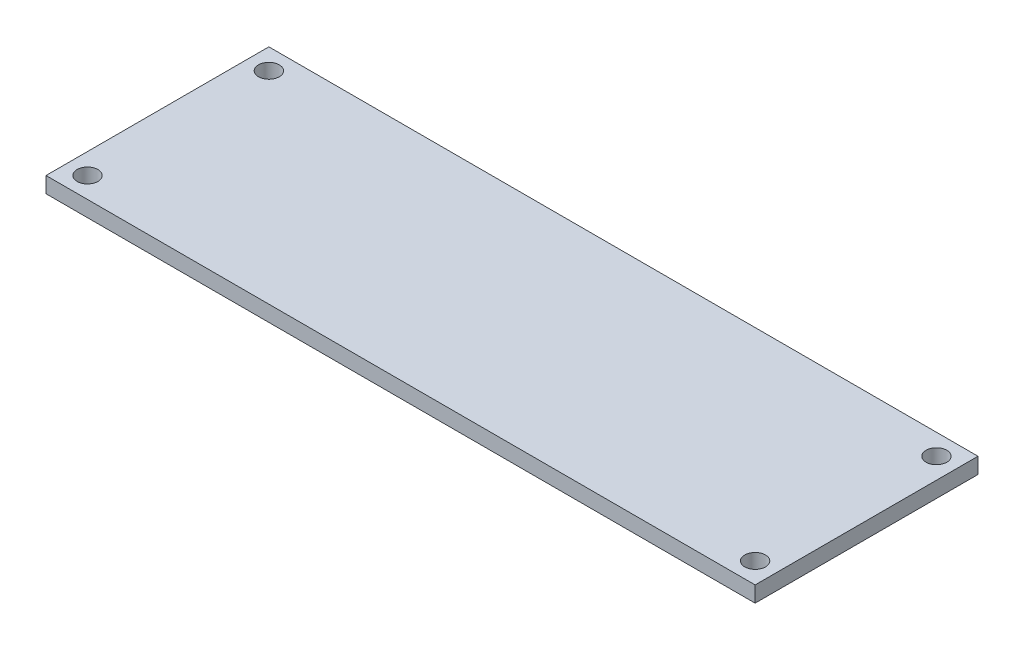
ISO-10303-21;
HEADER;
FILE_DESCRIPTION(('STEP AP214'),'2;1');
FILE_NAME('part.step','',(''),(''),'','','');
FILE_SCHEMA(('AUTOMOTIVE_DESIGN { 1 0 10303 214 1 1 1 1 }'));
ENDSEC;
DATA;
#1=APPLICATION_CONTEXT('core data for automotive mechanical design processes');
#2=APPLICATION_PROTOCOL_DEFINITION('international standard','automotive_design',2000,#1);
#3=PRODUCT_CONTEXT('',#1,'mechanical');
#4=PRODUCT('Part','Part','',(#3));
#5=PRODUCT_RELATED_PRODUCT_CATEGORY('part','',(#4));
#6=PRODUCT_DEFINITION_FORMATION('','',#4);
#7=PRODUCT_DEFINITION_CONTEXT('part definition',#1,'design');
#8=PRODUCT_DEFINITION('design','',#6,#7);
#9=PRODUCT_DEFINITION_SHAPE('','',#8);
#10=(LENGTH_UNIT() NAMED_UNIT(*) SI_UNIT(.MILLI.,.METRE.));
#11=(NAMED_UNIT(*) PLANE_ANGLE_UNIT() SI_UNIT($,.RADIAN.));
#12=(NAMED_UNIT(*) SI_UNIT($,.STERADIAN.) SOLID_ANGLE_UNIT());
#13=UNCERTAINTY_MEASURE_WITH_UNIT(LENGTH_MEASURE(1.E-05),#10,'distance_accuracy_value','');
#14=(GEOMETRIC_REPRESENTATION_CONTEXT(3) GLOBAL_UNCERTAINTY_ASSIGNED_CONTEXT((#13)) GLOBAL_UNIT_ASSIGNED_CONTEXT((#10,
#11,#12)) REPRESENTATION_CONTEXT('',''));
#15=CARTESIAN_POINT('',(0.,0.,0.));
#16=DIRECTION('',(0.,0.,1.));
#17=DIRECTION('',(1.,0.,0.));
#18=AXIS2_PLACEMENT_3D('',#15,#16,#17);
#19=CARTESIAN_POINT('',(71.12,3.175,22.352));
#20=DIRECTION('',(-1.,0.,0.));
#21=DIRECTION('',(0.,0.,1.));
#22=AXIS2_PLACEMENT_3D('',#19,#20,#21);
#23=PLANE('',#22);
#24=DIRECTION('',(0.,0.,-1.));
#25=VECTOR('',#24,1.);
#26=CARTESIAN_POINT('',(71.12,0.,22.352));
#27=LINE('',#26,#25);
#28=CARTESIAN_POINT('',(71.12,0.,22.352));
#29=VERTEX_POINT('',#28);
#30=CARTESIAN_POINT('',(71.12,0.,-22.352));
#31=VERTEX_POINT('',#30);
#32=EDGE_CURVE('E121',#29,#31,#27,.T.);
#33=ORIENTED_EDGE('',*,*,#32,.T.);
#34=DIRECTION('',(0.,-1.,0.));
#35=VECTOR('',#34,1.);
#36=CARTESIAN_POINT('',(71.12,3.175,-22.352));
#37=LINE('',#36,#35);
#38=CARTESIAN_POINT('',(71.12,3.175,-22.352));
#39=VERTEX_POINT('',#38);
#40=EDGE_CURVE('E12',#39,#31,#37,.T.);
#41=ORIENTED_EDGE('',*,*,#40,.F.);
#42=DIRECTION('',(0.,0.,-1.));
#43=VECTOR('',#42,1.);
#44=CARTESIAN_POINT('',(71.12,3.175,22.352));
#45=LINE('',#44,#43);
#46=CARTESIAN_POINT('',(71.12,3.175,22.352));
#47=VERTEX_POINT('',#46);
#48=EDGE_CURVE('E88',#47,#39,#45,.T.);
#49=ORIENTED_EDGE('',*,*,#48,.F.);
#50=DIRECTION('',(0.,-1.,0.));
#51=VECTOR('',#50,1.);
#52=CARTESIAN_POINT('',(71.12,3.175,22.352));
#53=LINE('',#52,#51);
#54=EDGE_CURVE('E99',#47,#29,#53,.T.);
#55=ORIENTED_EDGE('',*,*,#54,.T.);
#56=EDGE_LOOP('',(#33,#41,#49,#55));
#57=FACE_BOUND('',#56,.T.);
#58=ADVANCED_FACE('F37',(#57),#23,.F.);
#59=CARTESIAN_POINT('',(-71.12,3.175,-22.352));
#60=DIRECTION('',(0.,0.,1.));
#61=DIRECTION('',(1.,0.,0.));
#62=AXIS2_PLACEMENT_3D('',#59,#60,#61);
#63=PLANE('',#62);
#64=DIRECTION('',(-1.,0.,0.));
#65=VECTOR('',#64,1.);
#66=CARTESIAN_POINT('',(-71.12,0.,-22.352));
#67=LINE('',#66,#65);
#68=CARTESIAN_POINT('',(-71.12,0.,-22.352));
#69=VERTEX_POINT('',#68);
#70=EDGE_CURVE('E93',#31,#69,#67,.T.);
#71=ORIENTED_EDGE('',*,*,#70,.T.);
#72=DIRECTION('',(0.,-1.,0.));
#73=VECTOR('',#72,1.);
#74=CARTESIAN_POINT('',(-71.12,3.175,-22.352));
#75=LINE('',#74,#73);
#76=CARTESIAN_POINT('',(-71.12,3.175,-22.352));
#77=VERTEX_POINT('',#76);
#78=EDGE_CURVE('E45',#77,#69,#75,.T.);
#79=ORIENTED_EDGE('',*,*,#78,.F.);
#80=DIRECTION('',(-1.,0.,0.));
#81=VECTOR('',#80,1.);
#82=CARTESIAN_POINT('',(-71.12,3.175,-22.352));
#83=LINE('',#82,#81);
#84=EDGE_CURVE('E83',#39,#77,#83,.T.);
#85=ORIENTED_EDGE('',*,*,#84,.F.);
#86=ORIENTED_EDGE('',*,*,#40,.T.);
#87=EDGE_LOOP('',(#71,#79,#85,#86));
#88=FACE_BOUND('',#87,.T.);
#89=ADVANCED_FACE('F92',(#88),#63,.F.);
#90=CARTESIAN_POINT('',(-71.12,3.175,22.352));
#91=DIRECTION('',(1.,0.,0.));
#92=DIRECTION('',(0.,0.,-1.));
#93=AXIS2_PLACEMENT_3D('',#90,#91,#92);
#94=PLANE('',#93);
#95=DIRECTION('',(0.,0.,1.));
#96=VECTOR('',#95,1.);
#97=CARTESIAN_POINT('',(-71.12,0.,22.352));
#98=LINE('',#97,#96);
#99=CARTESIAN_POINT('',(-71.12,0.,22.352));
#100=VERTEX_POINT('',#99);
#101=EDGE_CURVE('E70',#69,#100,#98,.T.);
#102=ORIENTED_EDGE('',*,*,#101,.T.);
#103=DIRECTION('',(0.,-1.,0.));
#104=VECTOR('',#103,1.);
#105=CARTESIAN_POINT('',(-71.12,3.175,22.352));
#106=LINE('',#105,#104);
#107=CARTESIAN_POINT('',(-71.12,3.175,22.352));
#108=VERTEX_POINT('',#107);
#109=EDGE_CURVE('E94',#108,#100,#106,.T.);
#110=ORIENTED_EDGE('',*,*,#109,.F.);
#111=DIRECTION('',(0.,0.,1.));
#112=VECTOR('',#111,1.);
#113=CARTESIAN_POINT('',(-71.12,3.175,22.352));
#114=LINE('',#113,#112);
#115=EDGE_CURVE('E86',#77,#108,#114,.T.);
#116=ORIENTED_EDGE('',*,*,#115,.F.);
#117=ORIENTED_EDGE('',*,*,#78,.T.);
#118=EDGE_LOOP('',(#102,#110,#116,#117));
#119=FACE_BOUND('',#118,.T.);
#120=ADVANCED_FACE('F95',(#119),#94,.F.);
#121=CARTESIAN_POINT('',(-71.12,3.175,22.352));
#122=DIRECTION('',(0.,0.,-1.));
#123=DIRECTION('',(-1.,0.,0.));
#124=AXIS2_PLACEMENT_3D('',#121,#122,#123);
#125=PLANE('',#124);
#126=DIRECTION('',(1.,0.,0.));
#127=VECTOR('',#126,1.);
#128=CARTESIAN_POINT('',(-71.12,0.,22.352));
#129=LINE('',#128,#127);
#130=EDGE_CURVE('E76',#100,#29,#129,.T.);
#131=ORIENTED_EDGE('',*,*,#130,.T.);
#132=ORIENTED_EDGE('',*,*,#54,.F.);
#133=DIRECTION('',(1.,0.,0.));
#134=VECTOR('',#133,1.);
#135=CARTESIAN_POINT('',(-71.12,3.175,22.352));
#136=LINE('',#135,#134);
#137=EDGE_CURVE('E53',#108,#47,#136,.T.);
#138=ORIENTED_EDGE('',*,*,#137,.F.);
#139=ORIENTED_EDGE('',*,*,#109,.T.);
#140=EDGE_LOOP('',(#131,#132,#138,#139));
#141=FACE_BOUND('',#140,.T.);
#142=ADVANCED_FACE('F162',(#141),#125,.F.);
#143=CARTESIAN_POINT('',(0.,3.175,0.));
#144=DIRECTION('',(0.,-1.,0.));
#145=DIRECTION('',(0.,0.,-1.));
#146=AXIS2_PLACEMENT_3D('',#143,#144,#145);
#147=PLANE('',#146);
#148=CARTESIAN_POINT('',(-66.9544,3.175,18.1864));
#149=DIRECTION('',(0.,1.,0.));
#150=DIRECTION('',(0.,0.,-1.));
#151=AXIS2_PLACEMENT_3D('',#148,#149,#150);
#152=CIRCLE('',#151,2.0828);
#153=CARTESIAN_POINT('',(-66.9544,3.175,16.1036));
#154=VERTEX_POINT('',#153);
#155=EDGE_CURVE('E140',#154,#154,#152,.T.);
#156=ORIENTED_EDGE('',*,*,#155,.F.);
#157=EDGE_LOOP('',(#156));
#158=FACE_BOUND('',#157,.T.);
#159=CARTESIAN_POINT('',(66.9544,3.175,-18.1864));
#160=DIRECTION('',(0.,1.,0.));
#161=DIRECTION('',(0.,0.,-1.));
#162=AXIS2_PLACEMENT_3D('',#159,#160,#161);
#163=CIRCLE('',#162,2.0828);
#164=CARTESIAN_POINT('',(66.9544,3.175,-20.2692));
#165=VERTEX_POINT('',#164);
#166=EDGE_CURVE('E122',#165,#165,#163,.T.);
#167=ORIENTED_EDGE('',*,*,#166,.F.);
#168=EDGE_LOOP('',(#167));
#169=FACE_BOUND('',#168,.T.);
#170=CARTESIAN_POINT('',(66.9544,3.175,18.1864));
#171=DIRECTION('',(0.,1.,0.));
#172=DIRECTION('',(0.,0.,1.));
#173=AXIS2_PLACEMENT_3D('',#170,#171,#172);
#174=CIRCLE('',#173,2.0828);
#175=CARTESIAN_POINT('',(66.9544,3.175,20.2692));
#176=VERTEX_POINT('',#175);
#177=EDGE_CURVE('E133',#176,#176,#174,.T.);
#178=ORIENTED_EDGE('',*,*,#177,.F.);
#179=EDGE_LOOP('',(#178));
#180=FACE_BOUND('',#179,.T.);
#181=CARTESIAN_POINT('',(-66.9544,3.175,-18.1864));
#182=DIRECTION('',(0.,1.,0.));
#183=DIRECTION('',(0.,0.,1.));
#184=AXIS2_PLACEMENT_3D('',#181,#182,#183);
#185=CIRCLE('',#184,2.0828);
#186=CARTESIAN_POINT('',(-66.9544,3.175,-16.1036));
#187=VERTEX_POINT('',#186);
#188=EDGE_CURVE('E112',#187,#187,#185,.T.);
#189=ORIENTED_EDGE('',*,*,#188,.F.);
#190=EDGE_LOOP('',(#189));
#191=FACE_BOUND('',#190,.T.);
#192=ORIENTED_EDGE('',*,*,#48,.T.);
#193=ORIENTED_EDGE('',*,*,#84,.T.);
#194=ORIENTED_EDGE('',*,*,#115,.T.);
#195=ORIENTED_EDGE('',*,*,#137,.T.);
#196=EDGE_LOOP('',(#192,#193,#194,#195));
#197=FACE_BOUND('',#196,.T.);
#198=ADVANCED_FACE('F84',(#158,#169,#180,#191,#197),#147,.F.);
#199=CARTESIAN_POINT('',(0.,0.,0.));
#200=DIRECTION('',(0.,-1.,0.));
#201=DIRECTION('',(0.,0.,-1.));
#202=AXIS2_PLACEMENT_3D('',#199,#200,#201);
#203=PLANE('',#202);
#204=CARTESIAN_POINT('',(-66.9544,0.,18.1864));
#205=DIRECTION('',(0.,1.,0.));
#206=DIRECTION('',(0.,0.,-1.));
#207=AXIS2_PLACEMENT_3D('',#204,#205,#206);
#208=CIRCLE('',#207,2.0828);
#209=CARTESIAN_POINT('',(-66.9544,0.,16.1036));
#210=VERTEX_POINT('',#209);
#211=EDGE_CURVE('E118',#210,#210,#208,.T.);
#212=ORIENTED_EDGE('',*,*,#211,.T.);
#213=EDGE_LOOP('',(#212));
#214=FACE_BOUND('',#213,.T.);
#215=CARTESIAN_POINT('',(66.9544,0.,-18.1864));
#216=DIRECTION('',(0.,1.,0.));
#217=DIRECTION('',(0.,0.,-1.));
#218=AXIS2_PLACEMENT_3D('',#215,#216,#217);
#219=CIRCLE('',#218,2.0828);
#220=CARTESIAN_POINT('',(66.9544,0.,-20.2692));
#221=VERTEX_POINT('',#220);
#222=EDGE_CURVE('E127',#221,#221,#219,.T.);
#223=ORIENTED_EDGE('',*,*,#222,.T.);
#224=EDGE_LOOP('',(#223));
#225=FACE_BOUND('',#224,.T.);
#226=CARTESIAN_POINT('',(66.9544,0.,18.1864));
#227=DIRECTION('',(0.,1.,0.));
#228=DIRECTION('',(0.,0.,1.));
#229=AXIS2_PLACEMENT_3D('',#226,#227,#228);
#230=CIRCLE('',#229,2.0828);
#231=CARTESIAN_POINT('',(66.9544,0.,20.2692));
#232=VERTEX_POINT('',#231);
#233=EDGE_CURVE('E128',#232,#232,#230,.T.);
#234=ORIENTED_EDGE('',*,*,#233,.T.);
#235=EDGE_LOOP('',(#234));
#236=FACE_BOUND('',#235,.T.);
#237=CARTESIAN_POINT('',(-66.9544,0.,-18.1864));
#238=DIRECTION('',(0.,1.,0.));
#239=DIRECTION('',(0.,0.,1.));
#240=AXIS2_PLACEMENT_3D('',#237,#238,#239);
#241=CIRCLE('',#240,2.0828);
#242=CARTESIAN_POINT('',(-66.9544,0.,-16.1036));
#243=VERTEX_POINT('',#242);
#244=EDGE_CURVE('E117',#243,#243,#241,.T.);
#245=ORIENTED_EDGE('',*,*,#244,.T.);
#246=EDGE_LOOP('',(#245));
#247=FACE_BOUND('',#246,.T.);
#248=ORIENTED_EDGE('',*,*,#32,.F.);
#249=ORIENTED_EDGE('',*,*,#130,.F.);
#250=ORIENTED_EDGE('',*,*,#101,.F.);
#251=ORIENTED_EDGE('',*,*,#70,.F.);
#252=EDGE_LOOP('',(#248,#249,#250,#251));
#253=FACE_BOUND('',#252,.T.);
#254=ADVANCED_FACE('F149',(#214,#225,#236,#247,#253),#203,.T.);
#255=CARTESIAN_POINT('',(-66.9544,0.,-18.1864));
#256=DIRECTION('',(0.,1.,0.));
#257=DIRECTION('',(0.,0.,1.));
#258=AXIS2_PLACEMENT_3D('',#255,#256,#257);
#259=CYLINDRICAL_SURFACE('',#258,2.0828);
#260=ORIENTED_EDGE('',*,*,#244,.F.);
#261=EDGE_LOOP('',(#260));
#262=FACE_BOUND('',#261,.T.);
#263=ORIENTED_EDGE('',*,*,#188,.T.);
#264=EDGE_LOOP('',(#263));
#265=FACE_BOUND('',#264,.T.);
#266=ADVANCED_FACE('F169',(#262,#265),#259,.F.);
#267=CARTESIAN_POINT('',(66.9544,0.,18.1864));
#268=DIRECTION('',(0.,1.,0.));
#269=DIRECTION('',(0.,0.,1.));
#270=AXIS2_PLACEMENT_3D('',#267,#268,#269);
#271=CYLINDRICAL_SURFACE('',#270,2.0828);
#272=ORIENTED_EDGE('',*,*,#233,.F.);
#273=EDGE_LOOP('',(#272));
#274=FACE_BOUND('',#273,.T.);
#275=ORIENTED_EDGE('',*,*,#177,.T.);
#276=EDGE_LOOP('',(#275));
#277=FACE_BOUND('',#276,.T.);
#278=ADVANCED_FACE('F156',(#274,#277),#271,.F.);
#279=CARTESIAN_POINT('',(66.9544,0.,-18.1864));
#280=DIRECTION('',(0.,1.,0.));
#281=DIRECTION('',(0.,0.,1.));
#282=AXIS2_PLACEMENT_3D('',#279,#280,#281);
#283=CYLINDRICAL_SURFACE('',#282,2.0828);
#284=ORIENTED_EDGE('',*,*,#222,.F.);
#285=EDGE_LOOP('',(#284));
#286=FACE_BOUND('',#285,.T.);
#287=ORIENTED_EDGE('',*,*,#166,.T.);
#288=EDGE_LOOP('',(#287));
#289=FACE_BOUND('',#288,.T.);
#290=ADVANCED_FACE('F152',(#286,#289),#283,.F.);
#291=CARTESIAN_POINT('',(-66.9544,0.,18.1864));
#292=DIRECTION('',(0.,1.,0.));
#293=DIRECTION('',(0.,0.,1.));
#294=AXIS2_PLACEMENT_3D('',#291,#292,#293);
#295=CYLINDRICAL_SURFACE('',#294,2.0828);
#296=ORIENTED_EDGE('',*,*,#211,.F.);
#297=EDGE_LOOP('',(#296));
#298=FACE_BOUND('',#297,.T.);
#299=ORIENTED_EDGE('',*,*,#155,.T.);
#300=EDGE_LOOP('',(#299));
#301=FACE_BOUND('',#300,.T.);
#302=ADVANCED_FACE('F155',(#298,#301),#295,.F.);
#303=CLOSED_SHELL('',(#58,#89,#120,#142,#198,#254,#266,#278,#290,#302));
#304=MANIFOLD_SOLID_BREP('B2',#303);
#305=ADVANCED_BREP_SHAPE_REPRESENTATION('',(#18,#304),#14);
#306=SHAPE_DEFINITION_REPRESENTATION(#9,#305);
ENDSEC;
END-ISO-10303-21;
